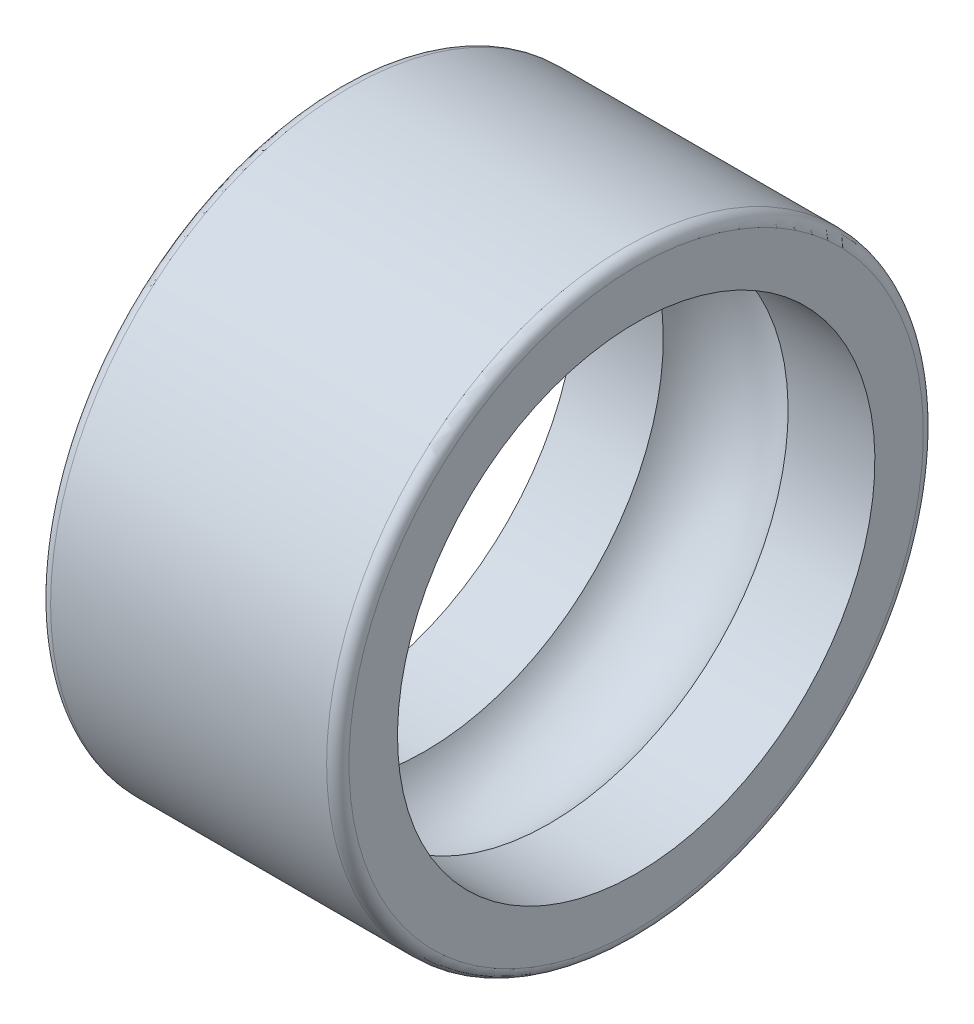
ISO-10303-21;
HEADER;
FILE_DESCRIPTION(('STEP AP214'),'2;1');
FILE_NAME('part.step','',(''),(''),'','','');
FILE_SCHEMA(('AUTOMOTIVE_DESIGN { 1 0 10303 214 1 1 1 1 }'));
ENDSEC;
DATA;
#1=APPLICATION_CONTEXT('core data for automotive mechanical design processes');
#2=APPLICATION_PROTOCOL_DEFINITION('international standard','automotive_design',2000,#1);
#3=PRODUCT_CONTEXT('',#1,'mechanical');
#4=PRODUCT('Part','Part','',(#3));
#5=PRODUCT_RELATED_PRODUCT_CATEGORY('part','',(#4));
#6=PRODUCT_DEFINITION_FORMATION('','',#4);
#7=PRODUCT_DEFINITION_CONTEXT('part definition',#1,'design');
#8=PRODUCT_DEFINITION('design','',#6,#7);
#9=PRODUCT_DEFINITION_SHAPE('','',#8);
#10=(LENGTH_UNIT() NAMED_UNIT(*) SI_UNIT(.MILLI.,.METRE.));
#11=(NAMED_UNIT(*) PLANE_ANGLE_UNIT() SI_UNIT($,.RADIAN.));
#12=(NAMED_UNIT(*) SI_UNIT($,.STERADIAN.) SOLID_ANGLE_UNIT());
#13=UNCERTAINTY_MEASURE_WITH_UNIT(LENGTH_MEASURE(1.E-05),#10,'distance_accuracy_value','');
#14=(GEOMETRIC_REPRESENTATION_CONTEXT(3) GLOBAL_UNCERTAINTY_ASSIGNED_CONTEXT((#13)) GLOBAL_UNIT_ASSIGNED_CONTEXT((#10,
#11,#12)) REPRESENTATION_CONTEXT('',''));
#15=CARTESIAN_POINT('',(0.,0.,0.));
#16=DIRECTION('',(0.,0.,1.));
#17=DIRECTION('',(1.,0.,0.));
#18=AXIS2_PLACEMENT_3D('',#15,#16,#17);
#19=CARTESIAN_POINT('',(0.150000000000002,0.,0.));
#20=DIRECTION('',(-1.,0.,0.));
#21=DIRECTION('',(0.,-1.,0.));
#22=AXIS2_PLACEMENT_3D('',#19,#20,#21);
#23=TOROIDAL_SURFACE('',#22,3.85,0.149999999999999);
#24=CARTESIAN_POINT('',(0.,0.,0.));
#25=DIRECTION('',(-1.,0.,0.));
#26=DIRECTION('',(0.,-1.,0.));
#27=AXIS2_PLACEMENT_3D('',#24,#25,#26);
#28=CIRCLE('',#27,3.85);
#29=CARTESIAN_POINT('',(0.,-3.85,0.));
#30=VERTEX_POINT('',#29);
#31=EDGE_CURVE('E10',#30,#30,#28,.T.);
#32=ORIENTED_EDGE('',*,*,#31,.F.);
#33=EDGE_LOOP('',(#32));
#34=FACE_BOUND('',#33,.T.);
#35=CARTESIAN_POINT('',(0.150000000000002,0.,0.));
#36=DIRECTION('',(-1.,0.,0.));
#37=DIRECTION('',(0.,-1.,0.));
#38=AXIS2_PLACEMENT_3D('',#35,#36,#37);
#39=CIRCLE('',#38,3.99999999999999);
#40=CARTESIAN_POINT('',(0.150000000000002,-3.99999999999999,0.));
#41=VERTEX_POINT('',#40);
#42=EDGE_CURVE('E58',#41,#41,#39,.T.);
#43=ORIENTED_EDGE('',*,*,#42,.T.);
#44=EDGE_LOOP('',(#43));
#45=FACE_BOUND('',#44,.T.);
#46=ADVANCED_FACE('F30',(#34,#45),#23,.T.);
#47=CARTESIAN_POINT('',(0.,3.2,0.));
#48=DIRECTION('',(1.,0.,0.));
#49=DIRECTION('',(0.,1.,0.));
#50=AXIS2_PLACEMENT_3D('',#47,#48,#49);
#51=PLANE('',#50);
#52=CARTESIAN_POINT('',(0.,0.,0.));
#53=DIRECTION('',(-1.,0.,0.));
#54=DIRECTION('',(0.,-1.,0.));
#55=AXIS2_PLACEMENT_3D('',#52,#53,#54);
#56=CIRCLE('',#55,3.2);
#57=CARTESIAN_POINT('',(0.,-3.2,0.));
#58=VERTEX_POINT('',#57);
#59=EDGE_CURVE('E36',#58,#58,#56,.T.);
#60=ORIENTED_EDGE('',*,*,#59,.F.);
#61=EDGE_LOOP('',(#60));
#62=FACE_BOUND('',#61,.T.);
#63=ORIENTED_EDGE('',*,*,#31,.T.);
#64=EDGE_LOOP('',(#63));
#65=FACE_BOUND('',#64,.T.);
#66=ADVANCED_FACE('F95',(#62,#65),#51,.F.);
#67=CARTESIAN_POINT('',(0.,0.,0.));
#68=DIRECTION('',(-1.,0.,0.));
#69=DIRECTION('',(0.,-1.,0.));
#70=AXIS2_PLACEMENT_3D('',#67,#68,#69);
#71=CYLINDRICAL_SURFACE('',#70,3.2);
#72=CARTESIAN_POINT('',(1.16333997346593,0.,0.));
#73=DIRECTION('',(-1.,0.,0.));
#74=DIRECTION('',(0.,-1.,0.));
#75=AXIS2_PLACEMENT_3D('',#72,#73,#74);
#76=CIRCLE('',#75,3.2);
#77=CARTESIAN_POINT('',(1.16333997346593,-3.2,0.));
#78=VERTEX_POINT('',#77);
#79=EDGE_CURVE('E40',#78,#78,#76,.T.);
#80=ORIENTED_EDGE('',*,*,#79,.F.);
#81=EDGE_LOOP('',(#80));
#82=FACE_BOUND('',#81,.T.);
#83=ORIENTED_EDGE('',*,*,#59,.T.);
#84=EDGE_LOOP('',(#83));
#85=FACE_BOUND('',#84,.T.);
#86=ADVANCED_FACE('F90',(#82,#85),#71,.F.);
#87=CARTESIAN_POINT('',(2.,0.,0.));
#88=DIRECTION('',(-1.,0.,0.));
#89=DIRECTION('',(0.,-1.,0.));
#90=AXIS2_PLACEMENT_3D('',#87,#88,#89);
#91=TOROIDAL_SURFACE('',#90,2.75,0.949999999999999);
#92=CARTESIAN_POINT('',(2.83666002653408,0.,0.));
#93=DIRECTION('',(-1.,0.,0.));
#94=DIRECTION('',(0.,-1.,0.));
#95=AXIS2_PLACEMENT_3D('',#92,#93,#94);
#96=CIRCLE('',#95,3.2);
#97=CARTESIAN_POINT('',(2.83666002653408,-3.2,0.));
#98=VERTEX_POINT('',#97);
#99=EDGE_CURVE('E44',#98,#98,#96,.T.);
#100=ORIENTED_EDGE('',*,*,#99,.F.);
#101=EDGE_LOOP('',(#100));
#102=FACE_BOUND('',#101,.T.);
#103=ORIENTED_EDGE('',*,*,#79,.T.);
#104=EDGE_LOOP('',(#103));
#105=FACE_BOUND('',#104,.T.);
#106=ADVANCED_FACE('F84',(#102,#105),#91,.F.);
#107=CARTESIAN_POINT('',(0.,0.,0.));
#108=DIRECTION('',(-1.,0.,0.));
#109=DIRECTION('',(0.,-1.,0.));
#110=AXIS2_PLACEMENT_3D('',#107,#108,#109);
#111=CYLINDRICAL_SURFACE('',#110,3.2);
#112=CARTESIAN_POINT('',(4.,0.,0.));
#113=DIRECTION('',(-1.,0.,0.));
#114=DIRECTION('',(0.,-1.,0.));
#115=AXIS2_PLACEMENT_3D('',#112,#113,#114);
#116=CIRCLE('',#115,3.2);
#117=CARTESIAN_POINT('',(4.,-3.2,0.));
#118=VERTEX_POINT('',#117);
#119=EDGE_CURVE('E49',#118,#118,#116,.T.);
#120=ORIENTED_EDGE('',*,*,#119,.F.);
#121=EDGE_LOOP('',(#120));
#122=FACE_BOUND('',#121,.T.);
#123=ORIENTED_EDGE('',*,*,#99,.T.);
#124=EDGE_LOOP('',(#123));
#125=FACE_BOUND('',#124,.T.);
#126=ADVANCED_FACE('F78',(#122,#125),#111,.F.);
#127=CARTESIAN_POINT('',(4.,3.85,0.));
#128=DIRECTION('',(-1.,0.,0.));
#129=DIRECTION('',(0.,-1.,0.));
#130=AXIS2_PLACEMENT_3D('',#127,#128,#129);
#131=PLANE('',#130);
#132=CARTESIAN_POINT('',(4.,0.,0.));
#133=DIRECTION('',(-1.,0.,0.));
#134=DIRECTION('',(0.,-1.,0.));
#135=AXIS2_PLACEMENT_3D('',#132,#133,#134);
#136=CIRCLE('',#135,3.85);
#137=CARTESIAN_POINT('',(4.,-3.84999999999999,0.));
#138=VERTEX_POINT('',#137);
#139=EDGE_CURVE('E52',#138,#138,#136,.T.);
#140=ORIENTED_EDGE('',*,*,#139,.F.);
#141=EDGE_LOOP('',(#140));
#142=FACE_BOUND('',#141,.T.);
#143=ORIENTED_EDGE('',*,*,#119,.T.);
#144=EDGE_LOOP('',(#143));
#145=FACE_BOUND('',#144,.T.);
#146=ADVANCED_FACE('F72',(#142,#145),#131,.F.);
#147=CARTESIAN_POINT('',(3.85,0.,0.));
#148=DIRECTION('',(-1.,0.,0.));
#149=DIRECTION('',(0.,-1.,0.));
#150=AXIS2_PLACEMENT_3D('',#147,#148,#149);
#151=TOROIDAL_SURFACE('',#150,3.85,0.149999999999999);
#152=CARTESIAN_POINT('',(3.85,0.,0.));
#153=DIRECTION('',(-1.,0.,0.));
#154=DIRECTION('',(0.,-1.,0.));
#155=AXIS2_PLACEMENT_3D('',#152,#153,#154);
#156=CIRCLE('',#155,3.99999999999999);
#157=CARTESIAN_POINT('',(3.85,-3.99999999999999,0.));
#158=VERTEX_POINT('',#157);
#159=EDGE_CURVE('E55',#158,#158,#156,.T.);
#160=ORIENTED_EDGE('',*,*,#159,.F.);
#161=EDGE_LOOP('',(#160));
#162=FACE_BOUND('',#161,.T.);
#163=ORIENTED_EDGE('',*,*,#139,.T.);
#164=EDGE_LOOP('',(#163));
#165=FACE_BOUND('',#164,.T.);
#166=ADVANCED_FACE('F66',(#162,#165),#151,.T.);
#167=CARTESIAN_POINT('',(0.,0.,0.));
#168=DIRECTION('',(-1.,0.,0.));
#169=DIRECTION('',(0.,-1.,0.));
#170=AXIS2_PLACEMENT_3D('',#167,#168,#169);
#171=CYLINDRICAL_SURFACE('',#170,3.99999999999999);
#172=ORIENTED_EDGE('',*,*,#42,.F.);
#173=EDGE_LOOP('',(#172));
#174=FACE_BOUND('',#173,.T.);
#175=ORIENTED_EDGE('',*,*,#159,.T.);
#176=EDGE_LOOP('',(#175));
#177=FACE_BOUND('',#176,.T.);
#178=ADVANCED_FACE('F63',(#174,#177),#171,.T.);
#179=CLOSED_SHELL('',(#46,#66,#86,#106,#126,#146,#166,#178));
#180=MANIFOLD_SOLID_BREP('B2',#179);
#181=ADVANCED_BREP_SHAPE_REPRESENTATION('',(#18,#180),#14);
#182=SHAPE_DEFINITION_REPRESENTATION(#9,#181);
ENDSEC;
END-ISO-10303-21;
